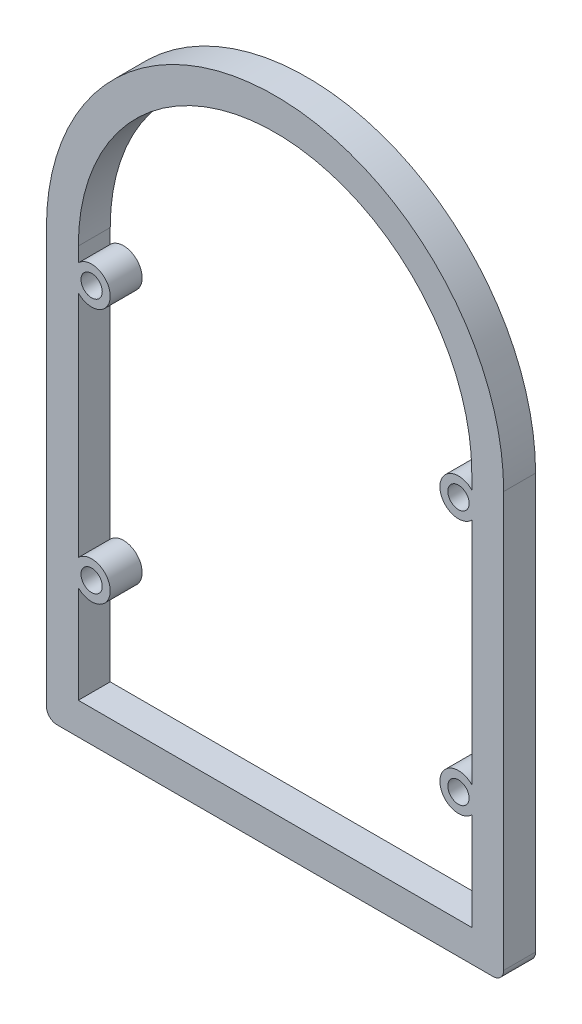
ISO-10303-21;
HEADER;
FILE_DESCRIPTION(('STEP AP214'),'2;1');
FILE_NAME('part.step','',(''),(''),'','','');
FILE_SCHEMA(('AUTOMOTIVE_DESIGN { 1 0 10303 214 1 1 1 1 }'));
ENDSEC;
DATA;
#1=APPLICATION_CONTEXT('core data for automotive mechanical design processes');
#2=APPLICATION_PROTOCOL_DEFINITION('international standard','automotive_design',2000,#1);
#3=PRODUCT_CONTEXT('',#1,'mechanical');
#4=PRODUCT('Part','Part','',(#3));
#5=PRODUCT_RELATED_PRODUCT_CATEGORY('part','',(#4));
#6=PRODUCT_DEFINITION_FORMATION('','',#4);
#7=PRODUCT_DEFINITION_CONTEXT('part definition',#1,'design');
#8=PRODUCT_DEFINITION('design','',#6,#7);
#9=PRODUCT_DEFINITION_SHAPE('','',#8);
#10=(LENGTH_UNIT() NAMED_UNIT(*) SI_UNIT(.MILLI.,.METRE.));
#11=(NAMED_UNIT(*) PLANE_ANGLE_UNIT() SI_UNIT($,.RADIAN.));
#12=(NAMED_UNIT(*) SI_UNIT($,.STERADIAN.) SOLID_ANGLE_UNIT());
#13=UNCERTAINTY_MEASURE_WITH_UNIT(LENGTH_MEASURE(1.E-05),#10,'distance_accuracy_value','');
#14=(GEOMETRIC_REPRESENTATION_CONTEXT(3) GLOBAL_UNCERTAINTY_ASSIGNED_CONTEXT((#13)) GLOBAL_UNIT_ASSIGNED_CONTEXT((#10,
#11,#12)) REPRESENTATION_CONTEXT('',''));
#15=CARTESIAN_POINT('',(0.,0.,0.));
#16=DIRECTION('',(0.,0.,1.));
#17=DIRECTION('',(1.,0.,0.));
#18=AXIS2_PLACEMENT_3D('',#15,#16,#17);
#19=CARTESIAN_POINT('',(-18.5,0.,3.));
#20=DIRECTION('',(1.,0.,0.));
#21=DIRECTION('',(0.,1.,0.));
#22=AXIS2_PLACEMENT_3D('',#19,#20,#21);
#23=PLANE('',#22);
#24=DIRECTION('',(0.,-1.,0.));
#25=VECTOR('',#24,1.);
#26=CARTESIAN_POINT('',(-18.5,0.,0.));
#27=LINE('',#26,#25);
#28=CARTESIAN_POINT('',(-18.5,20.5,0.));
#29=VERTEX_POINT('',#28);
#30=CARTESIAN_POINT('',(-18.5,19.1247448713916,0.));
#31=VERTEX_POINT('',#30);
#32=EDGE_CURVE('E343',#29,#31,#27,.T.);
#33=ORIENTED_EDGE('',*,*,#32,.F.);
#34=DIRECTION('',(0.,0.,-1.));
#35=VECTOR('',#34,1.);
#36=CARTESIAN_POINT('',(-18.5,20.5,3.));
#37=LINE('',#36,#35);
#38=CARTESIAN_POINT('',(-18.5,20.5,3.));
#39=VERTEX_POINT('',#38);
#40=EDGE_CURVE('E11',#39,#29,#37,.T.);
#41=ORIENTED_EDGE('',*,*,#40,.F.);
#42=DIRECTION('',(0.,-1.,0.));
#43=VECTOR('',#42,1.);
#44=CARTESIAN_POINT('',(-18.5,0.,3.));
#45=LINE('',#44,#43);
#46=CARTESIAN_POINT('',(-18.5,19.1247448713916,3.));
#47=VERTEX_POINT('',#46);
#48=EDGE_CURVE('E209',#39,#47,#45,.T.);
#49=ORIENTED_EDGE('',*,*,#48,.T.);
#50=DIRECTION('',(0.,0.,-1.));
#51=VECTOR('',#50,1.);
#52=CARTESIAN_POINT('',(-18.5,19.1247448713916,3.));
#53=LINE('',#52,#51);
#54=EDGE_CURVE('E131',#47,#31,#53,.T.);
#55=ORIENTED_EDGE('',*,*,#54,.T.);
#56=EDGE_LOOP('',(#33,#41,#49,#55));
#57=FACE_BOUND('',#56,.T.);
#58=ADVANCED_FACE('F47',(#57),#23,.T.);
#59=CARTESIAN_POINT('',(0.,20.5,3.));
#60=DIRECTION('',(0.,0.,-1.));
#61=DIRECTION('',(-1.,0.,0.));
#62=AXIS2_PLACEMENT_3D('',#59,#60,#61);
#63=CYLINDRICAL_SURFACE('',#62,18.5);
#64=CARTESIAN_POINT('',(0.,20.5,0.));
#65=DIRECTION('',(0.,0.,1.));
#66=DIRECTION('',(1.,0.,0.));
#67=AXIS2_PLACEMENT_3D('',#64,#65,#66);
#68=CIRCLE('',#67,18.5);
#69=CARTESIAN_POINT('',(18.5,20.5,0.));
#70=VERTEX_POINT('',#69);
#71=EDGE_CURVE('E347',#29,#70,#68,.F.);
#72=ORIENTED_EDGE('',*,*,#71,.T.);
#73=DIRECTION('',(0.,0.,-1.));
#74=VECTOR('',#73,1.);
#75=CARTESIAN_POINT('',(18.5,20.5,3.));
#76=LINE('',#75,#74);
#77=CARTESIAN_POINT('',(18.5,20.5,3.));
#78=VERTEX_POINT('',#77);
#79=EDGE_CURVE('E58',#78,#70,#76,.T.);
#80=ORIENTED_EDGE('',*,*,#79,.F.);
#81=CARTESIAN_POINT('',(0.,20.5,3.));
#82=DIRECTION('',(0.,0.,1.));
#83=DIRECTION('',(1.,0.,0.));
#84=AXIS2_PLACEMENT_3D('',#81,#82,#83);
#85=CIRCLE('',#84,18.5);
#86=EDGE_CURVE('E218',#39,#78,#85,.F.);
#87=ORIENTED_EDGE('',*,*,#86,.F.);
#88=ORIENTED_EDGE('',*,*,#40,.T.);
#89=EDGE_LOOP('',(#72,#80,#87,#88));
#90=FACE_BOUND('',#89,.T.);
#91=ADVANCED_FACE('F403',(#90),#63,.F.);
#92=CARTESIAN_POINT('',(18.5,0.,3.));
#93=DIRECTION('',(1.,0.,0.));
#94=DIRECTION('',(0.,1.,0.));
#95=AXIS2_PLACEMENT_3D('',#92,#93,#94);
#96=PLANE('',#95);
#97=DIRECTION('',(0.,-1.,0.));
#98=VECTOR('',#97,1.);
#99=CARTESIAN_POINT('',(18.5,0.,0.));
#100=LINE('',#99,#98);
#101=CARTESIAN_POINT('',(18.5,19.1247448713916,0.));
#102=VERTEX_POINT('',#101);
#103=EDGE_CURVE('E353',#70,#102,#100,.T.);
#104=ORIENTED_EDGE('',*,*,#103,.T.);
#105=DIRECTION('',(0.,0.,-1.));
#106=VECTOR('',#105,1.);
#107=CARTESIAN_POINT('',(18.5,19.1247448713916,3.));
#108=LINE('',#107,#106);
#109=CARTESIAN_POINT('',(18.5,19.1247448713916,3.));
#110=VERTEX_POINT('',#109);
#111=EDGE_CURVE('E283',#110,#102,#108,.T.);
#112=ORIENTED_EDGE('',*,*,#111,.F.);
#113=DIRECTION('',(0.,-1.,0.));
#114=VECTOR('',#113,1.);
#115=CARTESIAN_POINT('',(18.5,0.,3.));
#116=LINE('',#115,#114);
#117=EDGE_CURVE('E223',#78,#110,#116,.T.);
#118=ORIENTED_EDGE('',*,*,#117,.F.);
#119=ORIENTED_EDGE('',*,*,#79,.T.);
#120=EDGE_LOOP('',(#104,#112,#118,#119));
#121=FACE_BOUND('',#120,.T.);
#122=ADVANCED_FACE('F409',(#121),#96,.F.);
#123=CARTESIAN_POINT('',(17.25,17.9,3.));
#124=DIRECTION('',(0.,0.,-1.));
#125=DIRECTION('',(-1.,0.,0.));
#126=AXIS2_PLACEMENT_3D('',#123,#124,#125);
#127=CYLINDRICAL_SURFACE('',#126,1.75);
#128=CARTESIAN_POINT('',(17.25,17.9,0.));
#129=DIRECTION('',(0.,0.,1.));
#130=DIRECTION('',(1.,0.,0.));
#131=AXIS2_PLACEMENT_3D('',#128,#129,#130);
#132=CIRCLE('',#131,1.75);
#133=CARTESIAN_POINT('',(18.5,16.6752551286084,0.));
#134=VERTEX_POINT('',#133);
#135=EDGE_CURVE('E357',#102,#134,#132,.T.);
#136=ORIENTED_EDGE('',*,*,#135,.T.);
#137=DIRECTION('',(0.,0.,-1.));
#138=VECTOR('',#137,1.);
#139=CARTESIAN_POINT('',(18.5,16.6752551286084,3.));
#140=LINE('',#139,#138);
#141=CARTESIAN_POINT('',(18.5,16.6752551286084,3.));
#142=VERTEX_POINT('',#141);
#143=EDGE_CURVE('E279',#142,#134,#140,.T.);
#144=ORIENTED_EDGE('',*,*,#143,.F.);
#145=CARTESIAN_POINT('',(17.25,17.9,3.));
#146=DIRECTION('',(0.,0.,1.));
#147=DIRECTION('',(1.,0.,0.));
#148=AXIS2_PLACEMENT_3D('',#145,#146,#147);
#149=CIRCLE('',#148,1.75);
#150=EDGE_CURVE('E585',#110,#142,#149,.T.);
#151=ORIENTED_EDGE('',*,*,#150,.F.);
#152=ORIENTED_EDGE('',*,*,#111,.T.);
#153=EDGE_LOOP('',(#136,#144,#151,#152));
#154=FACE_BOUND('',#153,.T.);
#155=ADVANCED_FACE('F437',(#154),#127,.T.);
#156=CARTESIAN_POINT('',(18.5,-4.87525512860843,0.));
#157=VERTEX_POINT('',#156);
#158=EDGE_CURVE('E359',#134,#157,#100,.T.);
#159=ORIENTED_EDGE('',*,*,#158,.T.);
#160=DIRECTION('',(0.,0.,-1.));
#161=VECTOR('',#160,1.);
#162=CARTESIAN_POINT('',(18.5,-4.87525512860843,3.));
#163=LINE('',#162,#161);
#164=CARTESIAN_POINT('',(18.5,-4.87525512860843,3.));
#165=VERTEX_POINT('',#164);
#166=EDGE_CURVE('E275',#165,#157,#163,.T.);
#167=ORIENTED_EDGE('',*,*,#166,.F.);
#168=EDGE_CURVE('E584',#142,#165,#116,.T.);
#169=ORIENTED_EDGE('',*,*,#168,.F.);
#170=ORIENTED_EDGE('',*,*,#143,.T.);
#171=EDGE_LOOP('',(#159,#167,#169,#170));
#172=FACE_BOUND('',#171,.T.);
#173=ADVANCED_FACE('F433',(#172),#96,.F.);
#174=CARTESIAN_POINT('',(17.25,-6.10000000000001,3.));
#175=DIRECTION('',(0.,0.,-1.));
#176=DIRECTION('',(-1.,0.,0.));
#177=AXIS2_PLACEMENT_3D('',#174,#175,#176);
#178=CYLINDRICAL_SURFACE('',#177,1.75);
#179=CARTESIAN_POINT('',(17.25,-6.10000000000001,0.));
#180=DIRECTION('',(0.,0.,1.));
#181=DIRECTION('',(1.,0.,0.));
#182=AXIS2_PLACEMENT_3D('',#179,#180,#181);
#183=CIRCLE('',#182,1.75);
#184=CARTESIAN_POINT('',(18.5,-7.32474487139159,0.));
#185=VERTEX_POINT('',#184);
#186=EDGE_CURVE('E363',#157,#185,#183,.T.);
#187=ORIENTED_EDGE('',*,*,#186,.T.);
#188=DIRECTION('',(0.,0.,-1.));
#189=VECTOR('',#188,1.);
#190=CARTESIAN_POINT('',(18.5,-7.32474487139159,3.));
#191=LINE('',#190,#189);
#192=CARTESIAN_POINT('',(18.5,-7.32474487139159,3.));
#193=VERTEX_POINT('',#192);
#194=EDGE_CURVE('E271',#193,#185,#191,.T.);
#195=ORIENTED_EDGE('',*,*,#194,.F.);
#196=CARTESIAN_POINT('',(17.25,-6.10000000000001,3.));
#197=DIRECTION('',(0.,0.,1.));
#198=DIRECTION('',(1.,0.,0.));
#199=AXIS2_PLACEMENT_3D('',#196,#197,#198);
#200=CIRCLE('',#199,1.75);
#201=EDGE_CURVE('E580',#165,#193,#200,.T.);
#202=ORIENTED_EDGE('',*,*,#201,.F.);
#203=ORIENTED_EDGE('',*,*,#166,.T.);
#204=EDGE_LOOP('',(#187,#195,#202,#203));
#205=FACE_BOUND('',#204,.T.);
#206=ADVANCED_FACE('F431',(#205),#178,.T.);
#207=CARTESIAN_POINT('',(18.5,-16.5,0.));
#208=VERTEX_POINT('',#207);
#209=EDGE_CURVE('E358',#185,#208,#100,.T.);
#210=ORIENTED_EDGE('',*,*,#209,.T.);
#211=DIRECTION('',(0.,0.,-1.));
#212=VECTOR('',#211,1.);
#213=CARTESIAN_POINT('',(18.5,-16.5,3.));
#214=LINE('',#213,#212);
#215=CARTESIAN_POINT('',(18.5,-16.5,3.));
#216=VERTEX_POINT('',#215);
#217=EDGE_CURVE('E268',#216,#208,#214,.T.);
#218=ORIENTED_EDGE('',*,*,#217,.F.);
#219=EDGE_CURVE('E579',#193,#216,#116,.T.);
#220=ORIENTED_EDGE('',*,*,#219,.F.);
#221=ORIENTED_EDGE('',*,*,#194,.T.);
#222=EDGE_LOOP('',(#210,#218,#220,#221));
#223=FACE_BOUND('',#222,.T.);
#224=ADVANCED_FACE('F427',(#223),#96,.F.);
#225=CARTESIAN_POINT('',(0.,-16.5,3.));
#226=DIRECTION('',(0.,1.,0.));
#227=DIRECTION('',(0.,0.,1.));
#228=AXIS2_PLACEMENT_3D('',#225,#226,#227);
#229=PLANE('',#228);
#230=DIRECTION('',(1.,0.,0.));
#231=VECTOR('',#230,1.);
#232=CARTESIAN_POINT('',(0.,-16.5,0.));
#233=LINE('',#232,#231);
#234=CARTESIAN_POINT('',(-18.5,-16.5,0.));
#235=VERTEX_POINT('',#234);
#236=EDGE_CURVE('E367',#235,#208,#233,.T.);
#237=ORIENTED_EDGE('',*,*,#236,.F.);
#238=DIRECTION('',(0.,0.,-1.));
#239=VECTOR('',#238,1.);
#240=CARTESIAN_POINT('',(-18.5,-16.5,3.));
#241=LINE('',#240,#239);
#242=CARTESIAN_POINT('',(-18.5,-16.5,3.));
#243=VERTEX_POINT('',#242);
#244=EDGE_CURVE('E265',#243,#235,#241,.T.);
#245=ORIENTED_EDGE('',*,*,#244,.F.);
#246=DIRECTION('',(1.,0.,0.));
#247=VECTOR('',#246,1.);
#248=CARTESIAN_POINT('',(0.,-16.5,3.));
#249=LINE('',#248,#247);
#250=EDGE_CURVE('E216',#243,#216,#249,.T.);
#251=ORIENTED_EDGE('',*,*,#250,.T.);
#252=ORIENTED_EDGE('',*,*,#217,.T.);
#253=EDGE_LOOP('',(#237,#245,#251,#252));
#254=FACE_BOUND('',#253,.T.);
#255=ADVANCED_FACE('F415',(#254),#229,.T.);
#256=CARTESIAN_POINT('',(-18.5,-7.32474487139161,0.));
#257=VERTEX_POINT('',#256);
#258=EDGE_CURVE('E349',#257,#235,#27,.T.);
#259=ORIENTED_EDGE('',*,*,#258,.F.);
#260=DIRECTION('',(0.,0.,-1.));
#261=VECTOR('',#260,1.);
#262=CARTESIAN_POINT('',(-18.5,-7.32474487139161,3.));
#263=LINE('',#262,#261);
#264=CARTESIAN_POINT('',(-18.5,-7.32474487139161,3.));
#265=VERTEX_POINT('',#264);
#266=EDGE_CURVE('E204',#265,#257,#263,.T.);
#267=ORIENTED_EDGE('',*,*,#266,.F.);
#268=EDGE_CURVE('E191',#265,#243,#45,.T.);
#269=ORIENTED_EDGE('',*,*,#268,.T.);
#270=ORIENTED_EDGE('',*,*,#244,.T.);
#271=EDGE_LOOP('',(#259,#267,#269,#270));
#272=FACE_BOUND('',#271,.T.);
#273=ADVANCED_FACE('F405',(#272),#23,.T.);
#274=CARTESIAN_POINT('',(-17.25,-6.10000000000002,3.));
#275=DIRECTION('',(0.,0.,-1.));
#276=DIRECTION('',(-1.,0.,0.));
#277=AXIS2_PLACEMENT_3D('',#274,#275,#276);
#278=CYLINDRICAL_SURFACE('',#277,1.75);
#279=CARTESIAN_POINT('',(-17.25,-6.10000000000002,0.));
#280=DIRECTION('',(0.,0.,1.));
#281=DIRECTION('',(1.,0.,0.));
#282=AXIS2_PLACEMENT_3D('',#279,#280,#281);
#283=CIRCLE('',#282,1.75);
#284=CARTESIAN_POINT('',(-18.5,-4.87525512860843,0.));
#285=VERTEX_POINT('',#284);
#286=EDGE_CURVE('E199',#257,#285,#283,.T.);
#287=ORIENTED_EDGE('',*,*,#286,.T.);
#288=DIRECTION('',(0.,0.,-1.));
#289=VECTOR('',#288,1.);
#290=CARTESIAN_POINT('',(-18.5,-4.87525512860843,3.));
#291=LINE('',#290,#289);
#292=CARTESIAN_POINT('',(-18.5,-4.87525512860843,3.));
#293=VERTEX_POINT('',#292);
#294=EDGE_CURVE('E196',#293,#285,#291,.T.);
#295=ORIENTED_EDGE('',*,*,#294,.F.);
#296=CARTESIAN_POINT('',(-17.25,-6.10000000000002,3.));
#297=DIRECTION('',(0.,0.,1.));
#298=DIRECTION('',(1.,0.,0.));
#299=AXIS2_PLACEMENT_3D('',#296,#297,#298);
#300=CIRCLE('',#299,1.75);
#301=EDGE_CURVE('E183',#265,#293,#300,.T.);
#302=ORIENTED_EDGE('',*,*,#301,.F.);
#303=ORIENTED_EDGE('',*,*,#266,.T.);
#304=EDGE_LOOP('',(#287,#295,#302,#303));
#305=FACE_BOUND('',#304,.T.);
#306=ADVANCED_FACE('F197',(#305),#278,.T.);
#307=CARTESIAN_POINT('',(-18.5,16.6752551286084,0.));
#308=VERTEX_POINT('',#307);
#309=EDGE_CURVE('E348',#308,#285,#27,.T.);
#310=ORIENTED_EDGE('',*,*,#309,.F.);
#311=DIRECTION('',(0.,0.,-1.));
#312=VECTOR('',#311,1.);
#313=CARTESIAN_POINT('',(-18.5,16.6752551286084,3.));
#314=LINE('',#313,#312);
#315=CARTESIAN_POINT('',(-18.5,16.6752551286084,3.));
#316=VERTEX_POINT('',#315);
#317=EDGE_CURVE('E124',#316,#308,#314,.T.);
#318=ORIENTED_EDGE('',*,*,#317,.F.);
#319=EDGE_CURVE('E188',#316,#293,#45,.T.);
#320=ORIENTED_EDGE('',*,*,#319,.T.);
#321=ORIENTED_EDGE('',*,*,#294,.T.);
#322=EDGE_LOOP('',(#310,#318,#320,#321));
#323=FACE_BOUND('',#322,.T.);
#324=ADVANCED_FACE('F206',(#323),#23,.T.);
#325=CARTESIAN_POINT('',(-20.5,-18.5,3.));
#326=DIRECTION('',(0.,0.,-1.));
#327=DIRECTION('',(-1.,0.,0.));
#328=AXIS2_PLACEMENT_3D('',#325,#326,#327);
#329=CYLINDRICAL_SURFACE('',#328,1.);
#330=CARTESIAN_POINT('',(-20.5,-18.5,0.));
#331=DIRECTION('',(0.,0.,1.));
#332=DIRECTION('',(1.,0.,0.));
#333=AXIS2_PLACEMENT_3D('',#330,#331,#332);
#334=CIRCLE('',#333,1.);
#335=CARTESIAN_POINT('',(-20.5,-19.5,0.));
#336=VERTEX_POINT('',#335);
#337=CARTESIAN_POINT('',(-21.5,-18.5,0.));
#338=VERTEX_POINT('',#337);
#339=EDGE_CURVE('E320',#336,#338,#334,.F.);
#340=ORIENTED_EDGE('',*,*,#339,.F.);
#341=DIRECTION('',(0.,0.,-1.));
#342=VECTOR('',#341,1.);
#343=CARTESIAN_POINT('',(-20.5,-19.5,3.));
#344=LINE('',#343,#342);
#345=CARTESIAN_POINT('',(-20.5,-19.5,3.));
#346=VERTEX_POINT('',#345);
#347=EDGE_CURVE('E51',#346,#336,#344,.T.);
#348=ORIENTED_EDGE('',*,*,#347,.F.);
#349=CARTESIAN_POINT('',(-20.5,-18.5,3.));
#350=DIRECTION('',(0.,0.,1.));
#351=DIRECTION('',(1.,0.,0.));
#352=AXIS2_PLACEMENT_3D('',#349,#350,#351);
#353=CIRCLE('',#352,1.);
#354=CARTESIAN_POINT('',(-21.5,-18.5,3.));
#355=VERTEX_POINT('',#354);
#356=EDGE_CURVE('E244',#346,#355,#353,.F.);
#357=ORIENTED_EDGE('',*,*,#356,.T.);
#358=DIRECTION('',(0.,0.,-1.));
#359=VECTOR('',#358,1.);
#360=CARTESIAN_POINT('',(-21.5,-18.5,3.));
#361=LINE('',#360,#359);
#362=EDGE_CURVE('E290',#355,#338,#361,.T.);
#363=ORIENTED_EDGE('',*,*,#362,.T.);
#364=EDGE_LOOP('',(#340,#348,#357,#363));
#365=FACE_BOUND('',#364,.T.);
#366=ADVANCED_FACE('F49',(#365),#329,.T.);
#367=CARTESIAN_POINT('',(0.,-19.5,3.));
#368=DIRECTION('',(0.,1.,0.));
#369=DIRECTION('',(0.,0.,1.));
#370=AXIS2_PLACEMENT_3D('',#367,#368,#369);
#371=PLANE('',#370);
#372=DIRECTION('',(1.,0.,0.));
#373=VECTOR('',#372,1.);
#374=CARTESIAN_POINT('',(0.,-19.5,0.));
#375=LINE('',#374,#373);
#376=CARTESIAN_POINT('',(20.5,-19.5,0.));
#377=VERTEX_POINT('',#376);
#378=EDGE_CURVE('E314',#336,#377,#375,.T.);
#379=ORIENTED_EDGE('',*,*,#378,.T.);
#380=DIRECTION('',(0.,0.,-1.));
#381=VECTOR('',#380,1.);
#382=CARTESIAN_POINT('',(20.5,-19.5,3.));
#383=LINE('',#382,#381);
#384=CARTESIAN_POINT('',(20.5,-19.5,3.));
#385=VERTEX_POINT('',#384);
#386=EDGE_CURVE('E302',#385,#377,#383,.T.);
#387=ORIENTED_EDGE('',*,*,#386,.F.);
#388=DIRECTION('',(1.,0.,0.));
#389=VECTOR('',#388,1.);
#390=CARTESIAN_POINT('',(0.,-19.5,3.));
#391=LINE('',#390,#389);
#392=EDGE_CURVE('E241',#346,#385,#391,.T.);
#393=ORIENTED_EDGE('',*,*,#392,.F.);
#394=ORIENTED_EDGE('',*,*,#347,.T.);
#395=EDGE_LOOP('',(#379,#387,#393,#394));
#396=FACE_BOUND('',#395,.T.);
#397=ADVANCED_FACE('F313',(#396),#371,.F.);
#398=CARTESIAN_POINT('',(20.5,-18.5,3.));
#399=DIRECTION('',(0.,0.,-1.));
#400=DIRECTION('',(-1.,0.,0.));
#401=AXIS2_PLACEMENT_3D('',#398,#399,#400);
#402=CYLINDRICAL_SURFACE('',#401,1.);
#403=CARTESIAN_POINT('',(20.5,-18.5,0.));
#404=DIRECTION('',(0.,0.,1.));
#405=DIRECTION('',(1.,0.,0.));
#406=AXIS2_PLACEMENT_3D('',#403,#404,#405);
#407=CIRCLE('',#406,1.);
#408=CARTESIAN_POINT('',(21.5,-18.5,0.));
#409=VERTEX_POINT('',#408);
#410=EDGE_CURVE('E322',#377,#409,#407,.T.);
#411=ORIENTED_EDGE('',*,*,#410,.T.);
#412=DIRECTION('',(0.,0.,-1.));
#413=VECTOR('',#412,1.);
#414=CARTESIAN_POINT('',(21.5,-18.5,3.));
#415=LINE('',#414,#413);
#416=CARTESIAN_POINT('',(21.5,-18.5,3.));
#417=VERTEX_POINT('',#416);
#418=EDGE_CURVE('E300',#417,#409,#415,.T.);
#419=ORIENTED_EDGE('',*,*,#418,.F.);
#420=CARTESIAN_POINT('',(20.5,-18.5,3.));
#421=DIRECTION('',(0.,0.,1.));
#422=DIRECTION('',(1.,0.,0.));
#423=AXIS2_PLACEMENT_3D('',#420,#421,#422);
#424=CIRCLE('',#423,1.);
#425=EDGE_CURVE('E238',#385,#417,#424,.T.);
#426=ORIENTED_EDGE('',*,*,#425,.F.);
#427=ORIENTED_EDGE('',*,*,#386,.T.);
#428=EDGE_LOOP('',(#411,#419,#426,#427));
#429=FACE_BOUND('',#428,.T.);
#430=ADVANCED_FACE('F452',(#429),#402,.T.);
#431=CARTESIAN_POINT('',(21.5,0.,3.));
#432=DIRECTION('',(1.,0.,0.));
#433=DIRECTION('',(0.,1.,0.));
#434=AXIS2_PLACEMENT_3D('',#431,#432,#433);
#435=PLANE('',#434);
#436=DIRECTION('',(0.,-1.,0.));
#437=VECTOR('',#436,1.);
#438=CARTESIAN_POINT('',(21.5,0.,0.));
#439=LINE('',#438,#437);
#440=CARTESIAN_POINT('',(21.5,20.5,0.));
#441=VERTEX_POINT('',#440);
#442=EDGE_CURVE('E333',#441,#409,#439,.T.);
#443=ORIENTED_EDGE('',*,*,#442,.F.);
#444=DIRECTION('',(0.,0.,-1.));
#445=VECTOR('',#444,1.);
#446=CARTESIAN_POINT('',(21.5,20.5,3.));
#447=LINE('',#446,#445);
#448=CARTESIAN_POINT('',(21.5,20.5,3.));
#449=VERTEX_POINT('',#448);
#450=EDGE_CURVE('E297',#449,#441,#447,.T.);
#451=ORIENTED_EDGE('',*,*,#450,.F.);
#452=DIRECTION('',(0.,-1.,0.));
#453=VECTOR('',#452,1.);
#454=CARTESIAN_POINT('',(21.5,0.,3.));
#455=LINE('',#454,#453);
#456=EDGE_CURVE('E232',#449,#417,#455,.T.);
#457=ORIENTED_EDGE('',*,*,#456,.T.);
#458=ORIENTED_EDGE('',*,*,#418,.T.);
#459=EDGE_LOOP('',(#443,#451,#457,#458));
#460=FACE_BOUND('',#459,.T.);
#461=ADVANCED_FACE('F448',(#460),#435,.T.);
#462=CARTESIAN_POINT('',(0.,20.5,3.));
#463=DIRECTION('',(0.,0.,-1.));
#464=DIRECTION('',(-1.,0.,0.));
#465=AXIS2_PLACEMENT_3D('',#462,#463,#464);
#466=CYLINDRICAL_SURFACE('',#465,21.5);
#467=CARTESIAN_POINT('',(0.,20.5,0.));
#468=DIRECTION('',(0.,0.,1.));
#469=DIRECTION('',(1.,0.,0.));
#470=AXIS2_PLACEMENT_3D('',#467,#468,#469);
#471=CIRCLE('',#470,21.5);
#472=CARTESIAN_POINT('',(-21.5,20.5,0.));
#473=VERTEX_POINT('',#472);
#474=EDGE_CURVE('E336',#473,#441,#471,.F.);
#475=ORIENTED_EDGE('',*,*,#474,.F.);
#476=DIRECTION('',(0.,0.,-1.));
#477=VECTOR('',#476,1.);
#478=CARTESIAN_POINT('',(-21.5,20.5,3.));
#479=LINE('',#478,#477);
#480=CARTESIAN_POINT('',(-21.5,20.5,3.));
#481=VERTEX_POINT('',#480);
#482=EDGE_CURVE('E293',#481,#473,#479,.T.);
#483=ORIENTED_EDGE('',*,*,#482,.F.);
#484=CARTESIAN_POINT('',(0.,20.5,3.));
#485=DIRECTION('',(0.,0.,1.));
#486=DIRECTION('',(1.,0.,0.));
#487=AXIS2_PLACEMENT_3D('',#484,#485,#486);
#488=CIRCLE('',#487,21.5);
#489=EDGE_CURVE('E224',#481,#449,#488,.F.);
#490=ORIENTED_EDGE('',*,*,#489,.T.);
#491=ORIENTED_EDGE('',*,*,#450,.T.);
#492=EDGE_LOOP('',(#475,#483,#490,#491));
#493=FACE_BOUND('',#492,.T.);
#494=ADVANCED_FACE('F398',(#493),#466,.T.);
#495=CARTESIAN_POINT('',(-17.25,-6.10000000000002,3.));
#496=DIRECTION('',(0.,0.,-1.));
#497=DIRECTION('',(-1.,0.,0.));
#498=AXIS2_PLACEMENT_3D('',#495,#496,#497);
#499=CYLINDRICAL_SURFACE('',#498,1.);
#500=CARTESIAN_POINT('',(-17.25,-6.10000000000002,3.));
#501=DIRECTION('',(0.,0.,1.));
#502=DIRECTION('',(1.,0.,0.));
#503=AXIS2_PLACEMENT_3D('',#500,#501,#502);
#504=CIRCLE('',#503,1.);
#505=CARTESIAN_POINT('',(-16.25,-6.10000000000002,3.));
#506=VERTEX_POINT('',#505);
#507=EDGE_CURVE('E565',#506,#506,#504,.T.);
#508=ORIENTED_EDGE('',*,*,#507,.T.);
#509=EDGE_LOOP('',(#508));
#510=FACE_BOUND('',#509,.T.);
#511=CARTESIAN_POINT('',(-17.25,-6.10000000000002,0.));
#512=DIRECTION('',(0.,0.,1.));
#513=DIRECTION('',(1.,0.,0.));
#514=AXIS2_PLACEMENT_3D('',#511,#512,#513);
#515=CIRCLE('',#514,1.);
#516=CARTESIAN_POINT('',(-16.25,-6.10000000000002,0.));
#517=VERTEX_POINT('',#516);
#518=EDGE_CURVE('E249',#517,#517,#515,.T.);
#519=ORIENTED_EDGE('',*,*,#518,.F.);
#520=EDGE_LOOP('',(#519));
#521=FACE_BOUND('',#520,.T.);
#522=ADVANCED_FACE('F388',(#510,#521),#499,.F.);
#523=CARTESIAN_POINT('',(17.25,17.9,3.));
#524=DIRECTION('',(0.,0.,-1.));
#525=DIRECTION('',(-1.,0.,0.));
#526=AXIS2_PLACEMENT_3D('',#523,#524,#525);
#527=CYLINDRICAL_SURFACE('',#526,1.00000000000001);
#528=CARTESIAN_POINT('',(17.25,17.9,3.));
#529=DIRECTION('',(0.,0.,1.));
#530=DIRECTION('',(1.,0.,0.));
#531=AXIS2_PLACEMENT_3D('',#528,#529,#530);
#532=CIRCLE('',#531,1.00000000000001);
#533=CARTESIAN_POINT('',(18.25,17.9,3.));
#534=VERTEX_POINT('',#533);
#535=EDGE_CURVE('E568',#534,#534,#532,.T.);
#536=ORIENTED_EDGE('',*,*,#535,.T.);
#537=EDGE_LOOP('',(#536));
#538=FACE_BOUND('',#537,.T.);
#539=CARTESIAN_POINT('',(17.25,17.9,0.));
#540=DIRECTION('',(0.,0.,1.));
#541=DIRECTION('',(1.,0.,0.));
#542=AXIS2_PLACEMENT_3D('',#539,#540,#541);
#543=CIRCLE('',#542,1.00000000000001);
#544=CARTESIAN_POINT('',(18.25,17.9,0.));
#545=VERTEX_POINT('',#544);
#546=EDGE_CURVE('E255',#545,#545,#543,.T.);
#547=ORIENTED_EDGE('',*,*,#546,.F.);
#548=EDGE_LOOP('',(#547));
#549=FACE_BOUND('',#548,.T.);
#550=ADVANCED_FACE('F385',(#538,#549),#527,.F.);
#551=CARTESIAN_POINT('',(17.25,-6.10000000000001,3.));
#552=DIRECTION('',(0.,0.,-1.));
#553=DIRECTION('',(-1.,0.,0.));
#554=AXIS2_PLACEMENT_3D('',#551,#552,#553);
#555=CYLINDRICAL_SURFACE('',#554,1.00000000000001);
#556=CARTESIAN_POINT('',(17.25,-6.10000000000001,3.));
#557=DIRECTION('',(0.,0.,1.));
#558=DIRECTION('',(1.,0.,0.));
#559=AXIS2_PLACEMENT_3D('',#556,#557,#558);
#560=CIRCLE('',#559,1.00000000000001);
#561=CARTESIAN_POINT('',(18.25,-6.10000000000001,3.));
#562=VERTEX_POINT('',#561);
#563=EDGE_CURVE('E211',#562,#562,#560,.T.);
#564=ORIENTED_EDGE('',*,*,#563,.T.);
#565=EDGE_LOOP('',(#564));
#566=FACE_BOUND('',#565,.T.);
#567=CARTESIAN_POINT('',(17.25,-6.10000000000001,0.));
#568=DIRECTION('',(0.,0.,1.));
#569=DIRECTION('',(1.,0.,0.));
#570=AXIS2_PLACEMENT_3D('',#567,#568,#569);
#571=CIRCLE('',#570,1.00000000000001);
#572=CARTESIAN_POINT('',(18.25,-6.10000000000001,0.));
#573=VERTEX_POINT('',#572);
#574=EDGE_CURVE('E376',#573,#573,#571,.T.);
#575=ORIENTED_EDGE('',*,*,#574,.F.);
#576=EDGE_LOOP('',(#575));
#577=FACE_BOUND('',#576,.T.);
#578=ADVANCED_FACE('F387',(#566,#577),#555,.F.);
#579=CARTESIAN_POINT('',(-17.25,17.9,3.));
#580=DIRECTION('',(0.,0.,-1.));
#581=DIRECTION('',(-1.,0.,0.));
#582=AXIS2_PLACEMENT_3D('',#579,#580,#581);
#583=CYLINDRICAL_SURFACE('',#582,1.75);
#584=CARTESIAN_POINT('',(-17.25,17.9,0.));
#585=DIRECTION('',(0.,0.,1.));
#586=DIRECTION('',(1.,0.,0.));
#587=AXIS2_PLACEMENT_3D('',#584,#585,#586);
#588=CIRCLE('',#587,1.75);
#589=EDGE_CURVE('E373',#308,#31,#588,.T.);
#590=ORIENTED_EDGE('',*,*,#589,.T.);
#591=ORIENTED_EDGE('',*,*,#54,.F.);
#592=CARTESIAN_POINT('',(-17.25,17.9,3.));
#593=DIRECTION('',(0.,0.,1.));
#594=DIRECTION('',(1.,0.,0.));
#595=AXIS2_PLACEMENT_3D('',#592,#593,#594);
#596=CIRCLE('',#595,1.75);
#597=EDGE_CURVE('E67',#316,#47,#596,.T.);
#598=ORIENTED_EDGE('',*,*,#597,.F.);
#599=ORIENTED_EDGE('',*,*,#317,.T.);
#600=EDGE_LOOP('',(#590,#591,#598,#599));
#601=FACE_BOUND('',#600,.T.);
#602=ADVANCED_FACE('F395',(#601),#583,.T.);
#603=CARTESIAN_POINT('',(-21.5,0.,3.));
#604=DIRECTION('',(1.,0.,0.));
#605=DIRECTION('',(0.,1.,0.));
#606=AXIS2_PLACEMENT_3D('',#603,#604,#605);
#607=PLANE('',#606);
#608=DIRECTION('',(0.,-1.,0.));
#609=VECTOR('',#608,1.);
#610=CARTESIAN_POINT('',(-21.5,0.,0.));
#611=LINE('',#610,#609);
#612=EDGE_CURVE('E340',#473,#338,#611,.T.);
#613=ORIENTED_EDGE('',*,*,#612,.T.);
#614=ORIENTED_EDGE('',*,*,#362,.F.);
#615=DIRECTION('',(0.,-1.,0.));
#616=VECTOR('',#615,1.);
#617=CARTESIAN_POINT('',(-21.5,0.,3.));
#618=LINE('',#617,#616);
#619=EDGE_CURVE('E219',#481,#355,#618,.T.);
#620=ORIENTED_EDGE('',*,*,#619,.F.);
#621=ORIENTED_EDGE('',*,*,#482,.T.);
#622=EDGE_LOOP('',(#613,#614,#620,#621));
#623=FACE_BOUND('',#622,.T.);
#624=ADVANCED_FACE('F441',(#623),#607,.F.);
#625=CARTESIAN_POINT('',(-17.25,17.9,3.));
#626=DIRECTION('',(0.,0.,-1.));
#627=DIRECTION('',(-1.,0.,0.));
#628=AXIS2_PLACEMENT_3D('',#625,#626,#627);
#629=CYLINDRICAL_SURFACE('',#628,1.);
#630=CARTESIAN_POINT('',(-17.25,17.9,3.));
#631=DIRECTION('',(0.,0.,1.));
#632=DIRECTION('',(1.,0.,0.));
#633=AXIS2_PLACEMENT_3D('',#630,#631,#632);
#634=CIRCLE('',#633,1.);
#635=CARTESIAN_POINT('',(-16.25,17.9,3.));
#636=VERTEX_POINT('',#635);
#637=EDGE_CURVE('E294',#636,#636,#634,.T.);
#638=ORIENTED_EDGE('',*,*,#637,.T.);
#639=EDGE_LOOP('',(#638));
#640=FACE_BOUND('',#639,.T.);
#641=CARTESIAN_POINT('',(-17.25,17.9,0.));
#642=DIRECTION('',(0.,0.,1.));
#643=DIRECTION('',(1.,0.,0.));
#644=AXIS2_PLACEMENT_3D('',#641,#642,#643);
#645=CIRCLE('',#644,1.);
#646=CARTESIAN_POINT('',(-16.25,17.9,0.));
#647=VERTEX_POINT('',#646);
#648=EDGE_CURVE('E246',#647,#647,#645,.T.);
#649=ORIENTED_EDGE('',*,*,#648,.F.);
#650=EDGE_LOOP('',(#649));
#651=FACE_BOUND('',#650,.T.);
#652=ADVANCED_FACE('F444',(#640,#651),#629,.F.);
#653=CARTESIAN_POINT('',(0.,0.,3.));
#654=DIRECTION('',(0.,0.,1.));
#655=DIRECTION('',(1.,0.,0.));
#656=AXIS2_PLACEMENT_3D('',#653,#654,#655);
#657=PLANE('',#656);
#658=ORIENTED_EDGE('',*,*,#356,.F.);
#659=ORIENTED_EDGE('',*,*,#392,.T.);
#660=ORIENTED_EDGE('',*,*,#425,.T.);
#661=ORIENTED_EDGE('',*,*,#456,.F.);
#662=ORIENTED_EDGE('',*,*,#489,.F.);
#663=ORIENTED_EDGE('',*,*,#619,.T.);
#664=EDGE_LOOP('',(#658,#659,#660,#661,#662,#663));
#665=FACE_BOUND('',#664,.T.);
#666=ORIENTED_EDGE('',*,*,#48,.F.);
#667=ORIENTED_EDGE('',*,*,#86,.T.);
#668=ORIENTED_EDGE('',*,*,#117,.T.);
#669=ORIENTED_EDGE('',*,*,#150,.T.);
#670=ORIENTED_EDGE('',*,*,#168,.T.);
#671=ORIENTED_EDGE('',*,*,#201,.T.);
#672=ORIENTED_EDGE('',*,*,#219,.T.);
#673=ORIENTED_EDGE('',*,*,#250,.F.);
#674=ORIENTED_EDGE('',*,*,#268,.F.);
#675=ORIENTED_EDGE('',*,*,#301,.T.);
#676=ORIENTED_EDGE('',*,*,#319,.F.);
#677=ORIENTED_EDGE('',*,*,#597,.T.);
#678=EDGE_LOOP('',(#666,#667,#668,#669,#670,#671,#672,#673,#674,#675,#676,#677));
#679=FACE_BOUND('',#678,.T.);
#680=ORIENTED_EDGE('',*,*,#563,.F.);
#681=EDGE_LOOP('',(#680));
#682=FACE_BOUND('',#681,.T.);
#683=ORIENTED_EDGE('',*,*,#535,.F.);
#684=EDGE_LOOP('',(#683));
#685=FACE_BOUND('',#684,.T.);
#686=ORIENTED_EDGE('',*,*,#507,.F.);
#687=EDGE_LOOP('',(#686));
#688=FACE_BOUND('',#687,.T.);
#689=ORIENTED_EDGE('',*,*,#637,.F.);
#690=EDGE_LOOP('',(#689));
#691=FACE_BOUND('',#690,.T.);
#692=ADVANCED_FACE('F185',(#665,#679,#682,#685,#688,#691),#657,.T.);
#693=CARTESIAN_POINT('',(0.,0.,0.));
#694=DIRECTION('',(0.,0.,1.));
#695=DIRECTION('',(1.,0.,0.));
#696=AXIS2_PLACEMENT_3D('',#693,#694,#695);
#697=PLANE('',#696);
#698=ORIENTED_EDGE('',*,*,#339,.T.);
#699=ORIENTED_EDGE('',*,*,#612,.F.);
#700=ORIENTED_EDGE('',*,*,#474,.T.);
#701=ORIENTED_EDGE('',*,*,#442,.T.);
#702=ORIENTED_EDGE('',*,*,#410,.F.);
#703=ORIENTED_EDGE('',*,*,#378,.F.);
#704=EDGE_LOOP('',(#698,#699,#700,#701,#702,#703));
#705=FACE_BOUND('',#704,.T.);
#706=ORIENTED_EDGE('',*,*,#32,.T.);
#707=ORIENTED_EDGE('',*,*,#589,.F.);
#708=ORIENTED_EDGE('',*,*,#309,.T.);
#709=ORIENTED_EDGE('',*,*,#286,.F.);
#710=ORIENTED_EDGE('',*,*,#258,.T.);
#711=ORIENTED_EDGE('',*,*,#236,.T.);
#712=ORIENTED_EDGE('',*,*,#209,.F.);
#713=ORIENTED_EDGE('',*,*,#186,.F.);
#714=ORIENTED_EDGE('',*,*,#158,.F.);
#715=ORIENTED_EDGE('',*,*,#135,.F.);
#716=ORIENTED_EDGE('',*,*,#103,.F.);
#717=ORIENTED_EDGE('',*,*,#71,.F.);
#718=EDGE_LOOP('',(#706,#707,#708,#709,#710,#711,#712,#713,#714,#715,#716,#717));
#719=FACE_BOUND('',#718,.T.);
#720=ORIENTED_EDGE('',*,*,#574,.T.);
#721=EDGE_LOOP('',(#720));
#722=FACE_BOUND('',#721,.T.);
#723=ORIENTED_EDGE('',*,*,#546,.T.);
#724=EDGE_LOOP('',(#723));
#725=FACE_BOUND('',#724,.T.);
#726=ORIENTED_EDGE('',*,*,#518,.T.);
#727=EDGE_LOOP('',(#726));
#728=FACE_BOUND('',#727,.T.);
#729=ORIENTED_EDGE('',*,*,#648,.T.);
#730=EDGE_LOOP('',(#729));
#731=FACE_BOUND('',#730,.T.);
#732=ADVANCED_FACE('F317',(#705,#719,#722,#725,#728,#731),#697,.F.);
#733=CLOSED_SHELL('',(#58,#91,#122,#155,#173,#206,#224,#255,#273,#306,#324,#366,#397,#430,#461,
#494,#522,#550,#578,#602,#624,#652,#692,#732));
#734=MANIFOLD_SOLID_BREP('B2',#733);
#735=ADVANCED_BREP_SHAPE_REPRESENTATION('',(#18,#734),#14);
#736=SHAPE_DEFINITION_REPRESENTATION(#9,#735);
ENDSEC;
END-ISO-10303-21;
